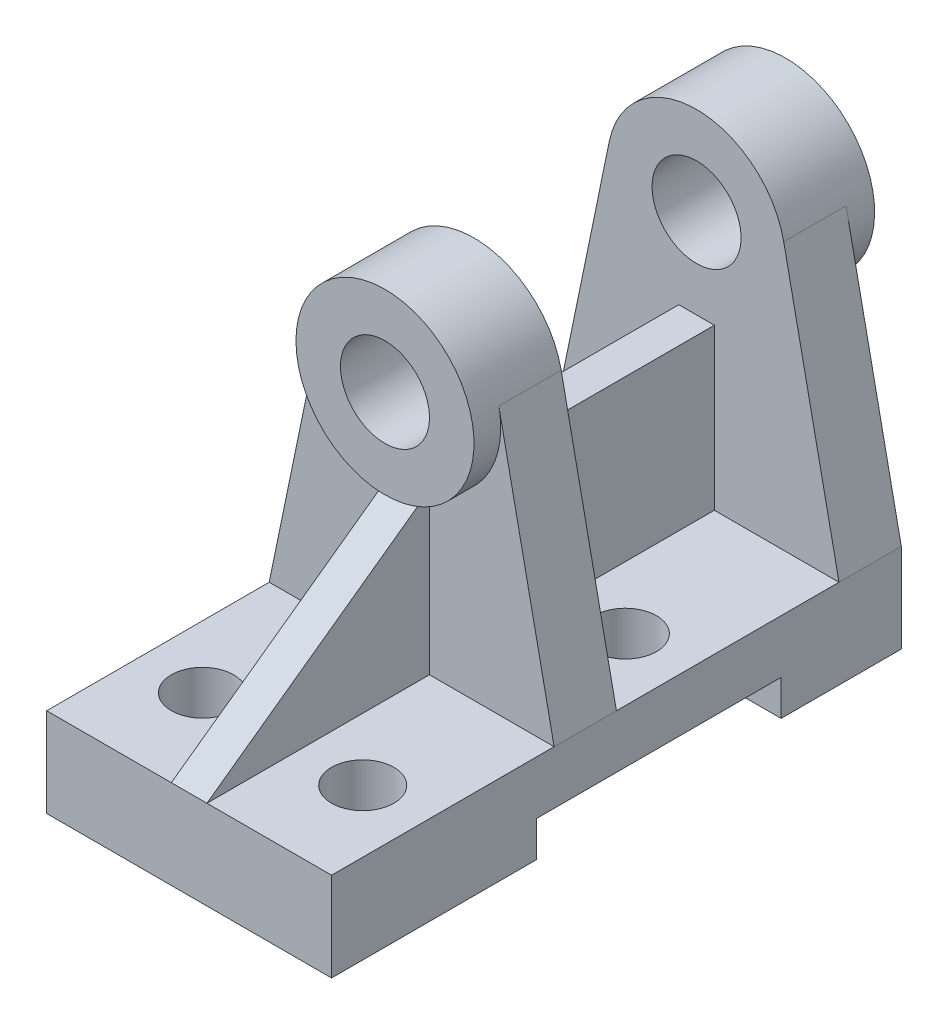
ISO-10303-21;
HEADER;
FILE_DESCRIPTION(('STEP AP214'),'2;1');
FILE_NAME('part.step','',(''),(''),'','','');
FILE_SCHEMA(('AUTOMOTIVE_DESIGN { 1 0 10303 214 1 1 1 1 }'));
ENDSEC;
DATA;
#1=APPLICATION_CONTEXT('core data for automotive mechanical design processes');
#2=APPLICATION_PROTOCOL_DEFINITION('international standard','automotive_design',2000,#1);
#3=PRODUCT_CONTEXT('',#1,'mechanical');
#4=PRODUCT('Part','Part','',(#3));
#5=PRODUCT_RELATED_PRODUCT_CATEGORY('part','',(#4));
#6=PRODUCT_DEFINITION_FORMATION('','',#4);
#7=PRODUCT_DEFINITION_CONTEXT('part definition',#1,'design');
#8=PRODUCT_DEFINITION('design','',#6,#7);
#9=PRODUCT_DEFINITION_SHAPE('','',#8);
#10=(LENGTH_UNIT() NAMED_UNIT(*) SI_UNIT(.MILLI.,.METRE.));
#11=(NAMED_UNIT(*) PLANE_ANGLE_UNIT() SI_UNIT($,.RADIAN.));
#12=(NAMED_UNIT(*) SI_UNIT($,.STERADIAN.) SOLID_ANGLE_UNIT());
#13=UNCERTAINTY_MEASURE_WITH_UNIT(LENGTH_MEASURE(1.E-05),#10,'distance_accuracy_value','');
#14=(GEOMETRIC_REPRESENTATION_CONTEXT(3) GLOBAL_UNCERTAINTY_ASSIGNED_CONTEXT((#13)) GLOBAL_UNIT_ASSIGNED_CONTEXT((#10,
#11,#12)) REPRESENTATION_CONTEXT('',''));
#15=CARTESIAN_POINT('',(0.,0.,0.));
#16=DIRECTION('',(0.,0.,1.));
#17=DIRECTION('',(1.,0.,0.));
#18=AXIS2_PLACEMENT_3D('',#15,#16,#17);
#19=CARTESIAN_POINT('',(0.,20.,0.));
#20=DIRECTION('',(0.,-1.,0.));
#21=DIRECTION('',(0.,0.,-1.));
#22=AXIS2_PLACEMENT_3D('',#19,#20,#21);
#23=PLANE('',#22);
#24=CARTESIAN_POINT('',(18.,20.,43.));
#25=DIRECTION('',(0.,1.,0.));
#26=DIRECTION('',(0.,0.,1.));
#27=AXIS2_PLACEMENT_3D('',#24,#25,#26);
#28=CIRCLE('',#27,7.);
#29=CARTESIAN_POINT('',(18.,20.,50.));
#30=VERTEX_POINT('',#29);
#31=EDGE_CURVE('E269',#30,#30,#28,.T.);
#32=ORIENTED_EDGE('',*,*,#31,.F.);
#33=EDGE_LOOP('',(#32));
#34=FACE_BOUND('',#33,.T.);
#35=DIRECTION('',(0.,0.,-1.));
#36=VECTOR('',#35,1.);
#37=CARTESIAN_POINT('',(4.,20.,64.));
#38=LINE('',#37,#36);
#39=CARTESIAN_POINT('',(4.,20.,64.));
#40=VERTEX_POINT('',#39);
#41=CARTESIAN_POINT('',(4.,20.,14.));
#42=VERTEX_POINT('',#41);
#43=EDGE_CURVE('E198',#40,#42,#38,.T.);
#44=ORIENTED_EDGE('',*,*,#43,.F.);
#45=DIRECTION('',(1.,0.,0.));
#46=VECTOR('',#45,1.);
#47=CARTESIAN_POINT('',(-32.,20.,64.));
#48=LINE('',#47,#46);
#49=CARTESIAN_POINT('',(32.,20.,64.));
#50=VERTEX_POINT('',#49);
#51=EDGE_CURVE('E221',#40,#50,#48,.T.);
#52=ORIENTED_EDGE('',*,*,#51,.T.);
#53=DIRECTION('',(0.,0.,-1.));
#54=VECTOR('',#53,1.);
#55=CARTESIAN_POINT('',(32.,20.,64.));
#56=LINE('',#55,#54);
#57=CARTESIAN_POINT('',(32.,20.,14.));
#58=VERTEX_POINT('',#57);
#59=EDGE_CURVE('E409',#50,#58,#56,.T.);
#60=ORIENTED_EDGE('',*,*,#59,.T.);
#61=DIRECTION('',(-1.,0.,0.));
#62=VECTOR('',#61,1.);
#63=CARTESIAN_POINT('',(32.,20.,14.));
#64=LINE('',#63,#62);
#65=EDGE_CURVE('E224',#58,#42,#64,.T.);
#66=ORIENTED_EDGE('',*,*,#65,.T.);
#67=EDGE_LOOP('',(#44,#52,#60,#66));
#68=FACE_BOUND('',#67,.T.);
#69=ADVANCED_FACE('F41',(#34,#68),#23,.F.);
#70=CARTESIAN_POINT('',(18.,20.,-16.));
#71=DIRECTION('',(0.,1.,0.));
#72=DIRECTION('',(0.,0.,1.));
#73=AXIS2_PLACEMENT_3D('',#70,#71,#72);
#74=CIRCLE('',#73,7.);
#75=CARTESIAN_POINT('',(18.,20.,-8.99999999999999));
#76=VERTEX_POINT('',#75);
#77=EDGE_CURVE('E259',#76,#76,#74,.T.);
#78=ORIENTED_EDGE('',*,*,#77,.F.);
#79=EDGE_LOOP('',(#78));
#80=FACE_BOUND('',#79,.T.);
#81=DIRECTION('',(0.,0.,-1.));
#82=VECTOR('',#81,1.);
#83=CARTESIAN_POINT('',(4.,20.,0.));
#84=LINE('',#83,#82);
#85=CARTESIAN_POINT('',(4.,20.,0.));
#86=VERTEX_POINT('',#85);
#87=CARTESIAN_POINT('',(4.,20.,-50.));
#88=VERTEX_POINT('',#87);
#89=EDGE_CURVE('E287',#86,#88,#84,.T.);
#90=ORIENTED_EDGE('',*,*,#89,.F.);
#91=DIRECTION('',(-1.,0.,0.));
#92=VECTOR('',#91,1.);
#93=CARTESIAN_POINT('',(32.,20.,0.));
#94=LINE('',#93,#92);
#95=CARTESIAN_POINT('',(32.,20.,0.));
#96=VERTEX_POINT('',#95);
#97=EDGE_CURVE('E344',#96,#86,#94,.T.);
#98=ORIENTED_EDGE('',*,*,#97,.F.);
#99=CARTESIAN_POINT('',(32.,20.,-50.));
#100=VERTEX_POINT('',#99);
#101=EDGE_CURVE('E251',#96,#100,#56,.T.);
#102=ORIENTED_EDGE('',*,*,#101,.T.);
#103=DIRECTION('',(1.,0.,0.));
#104=VECTOR('',#103,1.);
#105=CARTESIAN_POINT('',(0.,20.,-50.));
#106=LINE('',#105,#104);
#107=EDGE_CURVE('E389',#88,#100,#106,.T.);
#108=ORIENTED_EDGE('',*,*,#107,.F.);
#109=EDGE_LOOP('',(#90,#98,#102,#108));
#110=FACE_BOUND('',#109,.T.);
#111=ADVANCED_FACE('F415',(#80,#110),#23,.F.);
#112=CARTESIAN_POINT('',(0.,0.,-50.));
#113=DIRECTION('',(0.,0.,-1.));
#114=DIRECTION('',(-1.,0.,0.));
#115=AXIS2_PLACEMENT_3D('',#112,#113,#114);
#116=PLANE('',#115);
#117=CARTESIAN_POINT('',(0.,76.,-50.));
#118=DIRECTION('',(0.,0.,-1.));
#119=DIRECTION('',(-1.,0.,0.));
#120=AXIS2_PLACEMENT_3D('',#117,#118,#119);
#121=CIRCLE('',#120,10.);
#122=CARTESIAN_POINT('',(-10.,76.,-50.));
#123=VERTEX_POINT('',#122);
#124=EDGE_CURVE('E374',#123,#123,#121,.T.);
#125=ORIENTED_EDGE('',*,*,#124,.T.);
#126=EDGE_LOOP('',(#125));
#127=FACE_BOUND('',#126,.T.);
#128=DIRECTION('',(0.,1.,0.));
#129=VECTOR('',#128,1.);
#130=CARTESIAN_POINT('',(4.,20.,-50.));
#131=LINE('',#130,#129);
#132=CARTESIAN_POINT('',(4.,56.,-50.));
#133=VERTEX_POINT('',#132);
#134=EDGE_CURVE('E291',#88,#133,#131,.T.);
#135=ORIENTED_EDGE('',*,*,#134,.F.);
#136=ORIENTED_EDGE('',*,*,#107,.T.);
#137=DIRECTION('',(-0.202452606669412,0.979292061671471,0.));
#138=VECTOR('',#137,1.);
#139=CARTESIAN_POINT('',(34.6536187572094,7.16406853737846,-50.));
#140=LINE('',#139,#138);
#141=CARTESIAN_POINT('',(19.5858412334294,80.0490521333882,-50.));
#142=VERTEX_POINT('',#141);
#143=EDGE_CURVE('E386',#100,#142,#140,.T.);
#144=ORIENTED_EDGE('',*,*,#143,.T.);
#145=CARTESIAN_POINT('',(0.,76.,-50.));
#146=DIRECTION('',(0.,0.,-1.));
#147=DIRECTION('',(-1.,0.,0.));
#148=AXIS2_PLACEMENT_3D('',#145,#146,#147);
#149=CIRCLE('',#148,20.);
#150=CARTESIAN_POINT('',(-19.5858412334294,80.0490521333882,-50.));
#151=VERTEX_POINT('',#150);
#152=EDGE_CURVE('E377',#151,#142,#149,.T.);
#153=ORIENTED_EDGE('',*,*,#152,.F.);
#154=DIRECTION('',(0.202452606669412,0.979292061671471,0.));
#155=VECTOR('',#154,1.);
#156=CARTESIAN_POINT('',(-34.6536187572094,7.16406853737844,-50.));
#157=LINE('',#156,#155);
#158=CARTESIAN_POINT('',(-32.,20.,-50.));
#159=VERTEX_POINT('',#158);
#160=EDGE_CURVE('E393',#159,#151,#157,.T.);
#161=ORIENTED_EDGE('',*,*,#160,.F.);
#162=CARTESIAN_POINT('',(-4.,20.,-50.));
#163=VERTEX_POINT('',#162);
#164=EDGE_CURVE('E391',#159,#163,#106,.T.);
#165=ORIENTED_EDGE('',*,*,#164,.T.);
#166=DIRECTION('',(0.,1.,0.));
#167=VECTOR('',#166,1.);
#168=CARTESIAN_POINT('',(-4.,20.,-50.));
#169=LINE('',#168,#167);
#170=CARTESIAN_POINT('',(-4.,56.,-50.));
#171=VERTEX_POINT('',#170);
#172=EDGE_CURVE('E63',#163,#171,#169,.T.);
#173=ORIENTED_EDGE('',*,*,#172,.T.);
#174=DIRECTION('',(-1.,0.,0.));
#175=VECTOR('',#174,1.);
#176=CARTESIAN_POINT('',(4.,56.,-50.));
#177=LINE('',#176,#175);
#178=EDGE_CURVE('E58',#133,#171,#177,.T.);
#179=ORIENTED_EDGE('',*,*,#178,.F.);
#180=EDGE_LOOP('',(#135,#136,#144,#153,#161,#165,#173,#179));
#181=FACE_BOUND('',#180,.T.);
#182=ADVANCED_FACE('F423',(#127,#181),#116,.F.);
#183=CARTESIAN_POINT('',(0.,76.,0.));
#184=DIRECTION('',(0.,0.,-1.));
#185=DIRECTION('',(-1.,0.,0.));
#186=AXIS2_PLACEMENT_3D('',#183,#184,#185);
#187=PLANE('',#186);
#188=CARTESIAN_POINT('',(0.,76.,0.));
#189=DIRECTION('',(0.,0.,-1.));
#190=DIRECTION('',(-1.,0.,0.));
#191=AXIS2_PLACEMENT_3D('',#188,#189,#190);
#192=CIRCLE('',#191,10.);
#193=CARTESIAN_POINT('',(-10.,76.,0.));
#194=VERTEX_POINT('',#193);
#195=EDGE_CURVE('E325',#194,#194,#192,.T.);
#196=ORIENTED_EDGE('',*,*,#195,.F.);
#197=EDGE_LOOP('',(#196));
#198=FACE_BOUND('',#197,.T.);
#199=ORIENTED_EDGE('',*,*,#97,.T.);
#200=DIRECTION('',(0.,-1.,0.));
#201=VECTOR('',#200,1.);
#202=CARTESIAN_POINT('',(4.,56.,0.));
#203=LINE('',#202,#201);
#204=CARTESIAN_POINT('',(4.,56.,0.));
#205=VERTEX_POINT('',#204);
#206=EDGE_CURVE('E299',#205,#86,#203,.T.);
#207=ORIENTED_EDGE('',*,*,#206,.F.);
#208=DIRECTION('',(-1.,0.,0.));
#209=VECTOR('',#208,1.);
#210=CARTESIAN_POINT('',(4.,56.,0.));
#211=LINE('',#210,#209);
#212=CARTESIAN_POINT('',(-4.,56.,0.));
#213=VERTEX_POINT('',#212);
#214=EDGE_CURVE('E285',#205,#213,#211,.T.);
#215=ORIENTED_EDGE('',*,*,#214,.T.);
#216=DIRECTION('',(0.,-1.,0.));
#217=VECTOR('',#216,1.);
#218=CARTESIAN_POINT('',(-4.,56.,0.));
#219=LINE('',#218,#217);
#220=CARTESIAN_POINT('',(-4.,20.,0.));
#221=VERTEX_POINT('',#220);
#222=EDGE_CURVE('E290',#213,#221,#219,.T.);
#223=ORIENTED_EDGE('',*,*,#222,.T.);
#224=CARTESIAN_POINT('',(-32.,20.,0.));
#225=VERTEX_POINT('',#224);
#226=EDGE_CURVE('E348',#221,#225,#94,.T.);
#227=ORIENTED_EDGE('',*,*,#226,.T.);
#228=DIRECTION('',(0.202452606669412,0.979292061671471,0.));
#229=VECTOR('',#228,1.);
#230=CARTESIAN_POINT('',(-32.,20.,0.));
#231=LINE('',#230,#229);
#232=CARTESIAN_POINT('',(-19.5858412334294,80.0490521333883,0.));
#233=VERTEX_POINT('',#232);
#234=EDGE_CURVE('E347',#225,#233,#231,.T.);
#235=ORIENTED_EDGE('',*,*,#234,.T.);
#236=CARTESIAN_POINT('',(0.,76.,0.));
#237=DIRECTION('',(0.,0.,-1.));
#238=DIRECTION('',(-1.,0.,0.));
#239=AXIS2_PLACEMENT_3D('',#236,#237,#238);
#240=CIRCLE('',#239,20.);
#241=CARTESIAN_POINT('',(19.5858412334294,80.0490521333883,0.));
#242=VERTEX_POINT('',#241);
#243=EDGE_CURVE('E335',#233,#242,#240,.T.);
#244=ORIENTED_EDGE('',*,*,#243,.T.);
#245=DIRECTION('',(0.202452606669412,-0.979292061671471,0.));
#246=VECTOR('',#245,1.);
#247=CARTESIAN_POINT('',(32.,20.,0.));
#248=LINE('',#247,#246);
#249=EDGE_CURVE('E350',#242,#96,#248,.T.);
#250=ORIENTED_EDGE('',*,*,#249,.T.);
#251=EDGE_LOOP('',(#199,#207,#215,#223,#227,#235,#244,#250));
#252=FACE_BOUND('',#251,.T.);
#253=ADVANCED_FACE('F430',(#198,#252),#187,.T.);
#254=CARTESIAN_POINT('',(0.,76.,14.));
#255=DIRECTION('',(0.,0.,-1.));
#256=DIRECTION('',(-1.,0.,0.));
#257=AXIS2_PLACEMENT_3D('',#254,#255,#256);
#258=PLANE('',#257);
#259=DIRECTION('',(0.,1.,0.));
#260=VECTOR('',#259,1.);
#261=CARTESIAN_POINT('',(4.,56.,14.));
#262=LINE('',#261,#260);
#263=CARTESIAN_POINT('',(4.,56.,14.));
#264=VERTEX_POINT('',#263);
#265=EDGE_CURVE('E200',#42,#264,#262,.T.);
#266=ORIENTED_EDGE('',*,*,#265,.F.);
#267=ORIENTED_EDGE('',*,*,#65,.F.);
#268=DIRECTION('',(0.202452606669412,-0.979292061671471,0.));
#269=VECTOR('',#268,1.);
#270=CARTESIAN_POINT('',(32.,20.,14.));
#271=LINE('',#270,#269);
#272=CARTESIAN_POINT('',(19.5858412334294,80.0490521333883,14.));
#273=VERTEX_POINT('',#272);
#274=EDGE_CURVE('E361',#273,#58,#271,.T.);
#275=ORIENTED_EDGE('',*,*,#274,.F.);
#276=CARTESIAN_POINT('',(0.,76.,14.));
#277=DIRECTION('',(0.,0.,1.));
#278=DIRECTION('',(-1.,0.,0.));
#279=AXIS2_PLACEMENT_3D('',#276,#277,#278);
#280=CIRCLE('',#279,20.);
#281=CARTESIAN_POINT('',(0.,56.,14.));
#282=VERTEX_POINT('',#281);
#283=EDGE_CURVE('E357',#282,#273,#280,.T.);
#284=ORIENTED_EDGE('',*,*,#283,.F.);
#285=DIRECTION('',(-1.,0.,0.));
#286=VECTOR('',#285,1.);
#287=CARTESIAN_POINT('',(4.,56.,14.));
#288=LINE('',#287,#286);
#289=EDGE_CURVE('E216',#264,#282,#288,.T.);
#290=ORIENTED_EDGE('',*,*,#289,.F.);
#291=EDGE_LOOP('',(#266,#267,#275,#284,#290));
#292=FACE_BOUND('',#291,.T.);
#293=ADVANCED_FACE('F494',(#292),#258,.F.);
#294=CARTESIAN_POINT('',(-4.,56.,14.));
#295=VERTEX_POINT('',#294);
#296=EDGE_CURVE('E276',#282,#295,#288,.T.);
#297=ORIENTED_EDGE('',*,*,#296,.F.);
#298=CARTESIAN_POINT('',(-19.5858412334294,80.0490521333883,14.));
#299=VERTEX_POINT('',#298);
#300=EDGE_CURVE('E358',#299,#282,#280,.T.);
#301=ORIENTED_EDGE('',*,*,#300,.F.);
#302=DIRECTION('',(0.202452606669412,0.979292061671471,0.));
#303=VECTOR('',#302,1.);
#304=CARTESIAN_POINT('',(-32.,20.,14.));
#305=LINE('',#304,#303);
#306=CARTESIAN_POINT('',(-32.,20.,14.));
#307=VERTEX_POINT('',#306);
#308=EDGE_CURVE('E355',#307,#299,#305,.T.);
#309=ORIENTED_EDGE('',*,*,#308,.F.);
#310=CARTESIAN_POINT('',(-4.,20.,14.));
#311=VERTEX_POINT('',#310);
#312=EDGE_CURVE('E341',#311,#307,#64,.T.);
#313=ORIENTED_EDGE('',*,*,#312,.F.);
#314=DIRECTION('',(0.,1.,0.));
#315=VECTOR('',#314,1.);
#316=CARTESIAN_POINT('',(-4.,56.,14.));
#317=LINE('',#316,#315);
#318=EDGE_CURVE('E203',#311,#295,#317,.T.);
#319=ORIENTED_EDGE('',*,*,#318,.T.);
#320=EDGE_LOOP('',(#297,#301,#309,#313,#319));
#321=FACE_BOUND('',#320,.T.);
#322=ADVANCED_FACE('F497',(#321),#258,.F.);
#323=CARTESIAN_POINT('',(0.,0.,0.));
#324=DIRECTION('',(0.,-1.,0.));
#325=DIRECTION('',(0.,0.,-1.));
#326=AXIS2_PLACEMENT_3D('',#323,#324,#325);
#327=PLANE('',#326);
#328=DIRECTION('',(1.,0.,0.));
#329=VECTOR('',#328,1.);
#330=CARTESIAN_POINT('',(-32.,0.,-37.));
#331=LINE('',#330,#329);
#332=CARTESIAN_POINT('',(-32.,0.,-37.));
#333=VERTEX_POINT('',#332);
#334=CARTESIAN_POINT('',(32.,0.,-37.));
#335=VERTEX_POINT('',#334);
#336=EDGE_CURVE('E311',#333,#335,#331,.T.);
#337=ORIENTED_EDGE('',*,*,#336,.F.);
#338=DIRECTION('',(0.,0.,1.));
#339=VECTOR('',#338,1.);
#340=CARTESIAN_POINT('',(-32.,0.,64.));
#341=LINE('',#340,#339);
#342=CARTESIAN_POINT('',(-32.,0.,-64.));
#343=VERTEX_POINT('',#342);
#344=EDGE_CURVE('E246',#343,#333,#341,.T.);
#345=ORIENTED_EDGE('',*,*,#344,.F.);
#346=DIRECTION('',(-1.,0.,0.));
#347=VECTOR('',#346,1.);
#348=CARTESIAN_POINT('',(-32.,0.,-64.));
#349=LINE('',#348,#347);
#350=CARTESIAN_POINT('',(32.,0.,-64.));
#351=VERTEX_POINT('',#350);
#352=EDGE_CURVE('E242',#351,#343,#349,.T.);
#353=ORIENTED_EDGE('',*,*,#352,.F.);
#354=DIRECTION('',(0.,0.,-1.));
#355=VECTOR('',#354,1.);
#356=CARTESIAN_POINT('',(32.,0.,64.));
#357=LINE('',#356,#355);
#358=EDGE_CURVE('E243',#335,#351,#357,.T.);
#359=ORIENTED_EDGE('',*,*,#358,.F.);
#360=EDGE_LOOP('',(#337,#345,#353,#359));
#361=FACE_BOUND('',#360,.T.);
#362=ADVANCED_FACE('F460',(#361),#327,.T.);
#363=CARTESIAN_POINT('',(-18.,20.,43.));
#364=DIRECTION('',(0.,1.,0.));
#365=DIRECTION('',(0.,0.,1.));
#366=AXIS2_PLACEMENT_3D('',#363,#364,#365);
#367=CIRCLE('',#366,7.);
#368=CARTESIAN_POINT('',(-18.,20.,50.));
#369=VERTEX_POINT('',#368);
#370=EDGE_CURVE('E526',#369,#369,#367,.T.);
#371=ORIENTED_EDGE('',*,*,#370,.F.);
#372=EDGE_LOOP('',(#371));
#373=FACE_BOUND('',#372,.T.);
#374=CARTESIAN_POINT('',(-32.,20.,64.));
#375=VERTEX_POINT('',#374);
#376=CARTESIAN_POINT('',(-4.,20.,64.));
#377=VERTEX_POINT('',#376);
#378=EDGE_CURVE('E230',#375,#377,#48,.T.);
#379=ORIENTED_EDGE('',*,*,#378,.T.);
#380=DIRECTION('',(0.,0.,-1.));
#381=VECTOR('',#380,1.);
#382=CARTESIAN_POINT('',(-4.,20.,64.));
#383=LINE('',#382,#381);
#384=EDGE_CURVE('E278',#377,#311,#383,.T.);
#385=ORIENTED_EDGE('',*,*,#384,.T.);
#386=ORIENTED_EDGE('',*,*,#312,.T.);
#387=DIRECTION('',(0.,0.,1.));
#388=VECTOR('',#387,1.);
#389=CARTESIAN_POINT('',(-32.,20.,64.));
#390=LINE('',#389,#388);
#391=EDGE_CURVE('E236',#307,#375,#390,.T.);
#392=ORIENTED_EDGE('',*,*,#391,.T.);
#393=EDGE_LOOP('',(#379,#385,#386,#392));
#394=FACE_BOUND('',#393,.T.);
#395=ADVANCED_FACE('F502',(#373,#394),#23,.F.);
#396=CARTESIAN_POINT('',(-18.,20.,-16.));
#397=DIRECTION('',(0.,1.,0.));
#398=DIRECTION('',(0.,0.,-1.));
#399=AXIS2_PLACEMENT_3D('',#396,#397,#398);
#400=CIRCLE('',#399,7.);
#401=CARTESIAN_POINT('',(-18.,20.,-23.));
#402=VERTEX_POINT('',#401);
#403=EDGE_CURVE('E264',#402,#402,#400,.T.);
#404=ORIENTED_EDGE('',*,*,#403,.F.);
#405=EDGE_LOOP('',(#404));
#406=FACE_BOUND('',#405,.T.);
#407=ORIENTED_EDGE('',*,*,#226,.F.);
#408=DIRECTION('',(0.,0.,-1.));
#409=VECTOR('',#408,1.);
#410=CARTESIAN_POINT('',(-4.,20.,0.));
#411=LINE('',#410,#409);
#412=EDGE_CURVE('E288',#221,#163,#411,.T.);
#413=ORIENTED_EDGE('',*,*,#412,.T.);
#414=ORIENTED_EDGE('',*,*,#164,.F.);
#415=EDGE_CURVE('E234',#159,#225,#390,.T.);
#416=ORIENTED_EDGE('',*,*,#415,.T.);
#417=EDGE_LOOP('',(#407,#413,#414,#416));
#418=FACE_BOUND('',#417,.T.);
#419=ADVANCED_FACE('F483',(#406,#418),#23,.F.);
#420=CARTESIAN_POINT('',(32.,20.,64.));
#421=DIRECTION('',(-1.,0.,0.));
#422=DIRECTION('',(0.,0.,1.));
#423=AXIS2_PLACEMENT_3D('',#420,#421,#422);
#424=PLANE('',#423);
#425=DIRECTION('',(0.,0.,1.));
#426=VECTOR('',#425,1.);
#427=CARTESIAN_POINT('',(32.,8.,-37.));
#428=LINE('',#427,#426);
#429=CARTESIAN_POINT('',(32.,8.,-37.));
#430=VERTEX_POINT('',#429);
#431=CARTESIAN_POINT('',(32.,8.,18.));
#432=VERTEX_POINT('',#431);
#433=EDGE_CURVE('E307',#430,#432,#428,.T.);
#434=ORIENTED_EDGE('',*,*,#433,.F.);
#435=DIRECTION('',(0.,-1.,0.));
#436=VECTOR('',#435,1.);
#437=CARTESIAN_POINT('',(32.,8.,-37.));
#438=LINE('',#437,#436);
#439=EDGE_CURVE('E322',#430,#335,#438,.T.);
#440=ORIENTED_EDGE('',*,*,#439,.T.);
#441=ORIENTED_EDGE('',*,*,#358,.T.);
#442=DIRECTION('',(0.,-1.,0.));
#443=VECTOR('',#442,1.);
#444=CARTESIAN_POINT('',(32.,20.,-64.));
#445=LINE('',#444,#443);
#446=CARTESIAN_POINT('',(32.,20.,-64.));
#447=VERTEX_POINT('',#446);
#448=EDGE_CURVE('E11',#447,#351,#445,.T.);
#449=ORIENTED_EDGE('',*,*,#448,.F.);
#450=DIRECTION('',(0.,0.,-1.));
#451=VECTOR('',#450,1.);
#452=CARTESIAN_POINT('',(32.,20.,-50.));
#453=LINE('',#452,#451);
#454=EDGE_CURVE('E406',#100,#447,#453,.T.);
#455=ORIENTED_EDGE('',*,*,#454,.F.);
#456=ORIENTED_EDGE('',*,*,#101,.F.);
#457=DIRECTION('',(0.,0.,1.));
#458=VECTOR('',#457,1.);
#459=CARTESIAN_POINT('',(32.,20.,0.));
#460=LINE('',#459,#458);
#461=EDGE_CURVE('E353',#96,#58,#460,.T.);
#462=ORIENTED_EDGE('',*,*,#461,.T.);
#463=ORIENTED_EDGE('',*,*,#59,.F.);
#464=DIRECTION('',(0.,-1.,0.));
#465=VECTOR('',#464,1.);
#466=CARTESIAN_POINT('',(32.,20.,64.));
#467=LINE('',#466,#465);
#468=CARTESIAN_POINT('',(32.,0.,64.));
#469=VERTEX_POINT('',#468);
#470=EDGE_CURVE('E228',#50,#469,#467,.T.);
#471=ORIENTED_EDGE('',*,*,#470,.T.);
#472=CARTESIAN_POINT('',(32.,0.,18.));
#473=VERTEX_POINT('',#472);
#474=EDGE_CURVE('E239',#469,#473,#357,.T.);
#475=ORIENTED_EDGE('',*,*,#474,.T.);
#476=DIRECTION('',(0.,-1.,0.));
#477=VECTOR('',#476,1.);
#478=CARTESIAN_POINT('',(32.,8.,18.));
#479=LINE('',#478,#477);
#480=EDGE_CURVE('E319',#432,#473,#479,.T.);
#481=ORIENTED_EDGE('',*,*,#480,.F.);
#482=EDGE_LOOP('',(#434,#440,#441,#449,#455,#456,#462,#463,#471,#475,#481));
#483=FACE_BOUND('',#482,.T.);
#484=ADVANCED_FACE('F43',(#483),#424,.F.);
#485=CARTESIAN_POINT('',(-32.,20.,-64.));
#486=DIRECTION('',(0.,0.,1.));
#487=DIRECTION('',(1.,0.,0.));
#488=AXIS2_PLACEMENT_3D('',#485,#486,#487);
#489=PLANE('',#488);
#490=ORIENTED_EDGE('',*,*,#352,.T.);
#491=DIRECTION('',(0.,-1.,0.));
#492=VECTOR('',#491,1.);
#493=CARTESIAN_POINT('',(-32.,20.,-64.));
#494=LINE('',#493,#492);
#495=CARTESIAN_POINT('',(-32.,20.,-64.));
#496=VERTEX_POINT('',#495);
#497=EDGE_CURVE('E50',#496,#343,#494,.T.);
#498=ORIENTED_EDGE('',*,*,#497,.F.);
#499=DIRECTION('',(0.202452606669412,0.979292061671471,0.));
#500=VECTOR('',#499,1.);
#501=CARTESIAN_POINT('',(-34.6536187572094,7.16406853737844,-64.));
#502=LINE('',#501,#500);
#503=CARTESIAN_POINT('',(-19.5858412334294,80.0490521333883,-64.));
#504=VERTEX_POINT('',#503);
#505=EDGE_CURVE('E390',#496,#504,#502,.T.);
#506=ORIENTED_EDGE('',*,*,#505,.T.);
#507=CARTESIAN_POINT('',(0.,76.,-64.));
#508=DIRECTION('',(0.,0.,-1.));
#509=DIRECTION('',(-1.,0.,0.));
#510=AXIS2_PLACEMENT_3D('',#507,#508,#509);
#511=CIRCLE('',#510,20.);
#512=CARTESIAN_POINT('',(19.5858412334294,80.0490521333883,-64.));
#513=VERTEX_POINT('',#512);
#514=EDGE_CURVE('E385',#513,#504,#511,.T.);
#515=ORIENTED_EDGE('',*,*,#514,.F.);
#516=DIRECTION('',(-0.202452606669412,0.979292061671471,0.));
#517=VECTOR('',#516,1.);
#518=CARTESIAN_POINT('',(34.6536187572094,7.16406853737846,-64.));
#519=LINE('',#518,#517);
#520=EDGE_CURVE('E398',#447,#513,#519,.T.);
#521=ORIENTED_EDGE('',*,*,#520,.F.);
#522=ORIENTED_EDGE('',*,*,#448,.T.);
#523=EDGE_LOOP('',(#490,#498,#506,#515,#521,#522));
#524=FACE_BOUND('',#523,.T.);
#525=ADVANCED_FACE('F463',(#524),#489,.F.);
#526=CARTESIAN_POINT('',(-32.,20.,64.));
#527=DIRECTION('',(1.,0.,0.));
#528=DIRECTION('',(0.,0.,-1.));
#529=AXIS2_PLACEMENT_3D('',#526,#527,#528);
#530=PLANE('',#529);
#531=ORIENTED_EDGE('',*,*,#344,.T.);
#532=DIRECTION('',(0.,-1.,0.));
#533=VECTOR('',#532,1.);
#534=CARTESIAN_POINT('',(-32.,8.,-37.));
#535=LINE('',#534,#533);
#536=CARTESIAN_POINT('',(-32.,8.,-37.));
#537=VERTEX_POINT('',#536);
#538=EDGE_CURVE('E326',#537,#333,#535,.T.);
#539=ORIENTED_EDGE('',*,*,#538,.F.);
#540=DIRECTION('',(0.,0.,-1.));
#541=VECTOR('',#540,1.);
#542=CARTESIAN_POINT('',(-32.,8.,-37.));
#543=LINE('',#542,#541);
#544=CARTESIAN_POINT('',(-32.,8.,18.));
#545=VERTEX_POINT('',#544);
#546=EDGE_CURVE('E314',#545,#537,#543,.T.);
#547=ORIENTED_EDGE('',*,*,#546,.F.);
#548=DIRECTION('',(0.,-1.,0.));
#549=VECTOR('',#548,1.);
#550=CARTESIAN_POINT('',(-32.,8.,18.));
#551=LINE('',#550,#549);
#552=CARTESIAN_POINT('',(-32.,0.,18.));
#553=VERTEX_POINT('',#552);
#554=EDGE_CURVE('E328',#545,#553,#551,.T.);
#555=ORIENTED_EDGE('',*,*,#554,.T.);
#556=CARTESIAN_POINT('',(-32.,0.,64.));
#557=VERTEX_POINT('',#556);
#558=EDGE_CURVE('E245',#553,#557,#341,.T.);
#559=ORIENTED_EDGE('',*,*,#558,.T.);
#560=DIRECTION('',(0.,-1.,0.));
#561=VECTOR('',#560,1.);
#562=CARTESIAN_POINT('',(-32.,20.,64.));
#563=LINE('',#562,#561);
#564=EDGE_CURVE('E253',#375,#557,#563,.T.);
#565=ORIENTED_EDGE('',*,*,#564,.F.);
#566=ORIENTED_EDGE('',*,*,#391,.F.);
#567=DIRECTION('',(0.,0.,1.));
#568=VECTOR('',#567,1.);
#569=CARTESIAN_POINT('',(-32.,20.,0.));
#570=LINE('',#569,#568);
#571=EDGE_CURVE('E371',#225,#307,#570,.T.);
#572=ORIENTED_EDGE('',*,*,#571,.F.);
#573=ORIENTED_EDGE('',*,*,#415,.F.);
#574=EDGE_CURVE('E231',#496,#159,#390,.T.);
#575=ORIENTED_EDGE('',*,*,#574,.F.);
#576=ORIENTED_EDGE('',*,*,#497,.T.);
#577=EDGE_LOOP('',(#531,#539,#547,#555,#559,#565,#566,#572,#573,#575,#576));
#578=FACE_BOUND('',#577,.T.);
#579=ADVANCED_FACE('F448',(#578),#530,.F.);
#580=CARTESIAN_POINT('',(-32.,20.,64.));
#581=DIRECTION('',(0.,0.,-1.));
#582=DIRECTION('',(-1.,0.,0.));
#583=AXIS2_PLACEMENT_3D('',#580,#581,#582);
#584=PLANE('',#583);
#585=DIRECTION('',(1.,0.,0.));
#586=VECTOR('',#585,1.);
#587=CARTESIAN_POINT('',(-32.,0.,64.));
#588=LINE('',#587,#586);
#589=EDGE_CURVE('E249',#557,#469,#588,.T.);
#590=ORIENTED_EDGE('',*,*,#589,.T.);
#591=ORIENTED_EDGE('',*,*,#470,.F.);
#592=ORIENTED_EDGE('',*,*,#51,.F.);
#593=DIRECTION('',(-1.,0.,0.));
#594=VECTOR('',#593,1.);
#595=CARTESIAN_POINT('',(4.,20.,64.));
#596=LINE('',#595,#594);
#597=EDGE_CURVE('E207',#40,#377,#596,.T.);
#598=ORIENTED_EDGE('',*,*,#597,.T.);
#599=ORIENTED_EDGE('',*,*,#378,.F.);
#600=ORIENTED_EDGE('',*,*,#564,.T.);
#601=EDGE_LOOP('',(#590,#591,#592,#598,#599,#600));
#602=FACE_BOUND('',#601,.T.);
#603=ADVANCED_FACE('F226',(#602),#584,.F.);
#604=CARTESIAN_POINT('',(18.,0.,43.));
#605=DIRECTION('',(0.,1.,0.));
#606=DIRECTION('',(0.,0.,1.));
#607=AXIS2_PLACEMENT_3D('',#604,#605,#606);
#608=CIRCLE('',#607,7.);
#609=CARTESIAN_POINT('',(18.,0.,50.));
#610=VERTEX_POINT('',#609);
#611=EDGE_CURVE('E272',#610,#610,#608,.T.);
#612=ORIENTED_EDGE('',*,*,#611,.T.);
#613=EDGE_LOOP('',(#612));
#614=FACE_BOUND('',#613,.T.);
#615=CARTESIAN_POINT('',(-18.,0.,43.));
#616=DIRECTION('',(0.,1.,0.));
#617=DIRECTION('',(0.,0.,1.));
#618=AXIS2_PLACEMENT_3D('',#615,#616,#617);
#619=CIRCLE('',#618,7.);
#620=CARTESIAN_POINT('',(-18.,0.,50.));
#621=VERTEX_POINT('',#620);
#622=EDGE_CURVE('E528',#621,#621,#619,.T.);
#623=ORIENTED_EDGE('',*,*,#622,.T.);
#624=EDGE_LOOP('',(#623));
#625=FACE_BOUND('',#624,.T.);
#626=DIRECTION('',(-1.,0.,0.));
#627=VECTOR('',#626,1.);
#628=CARTESIAN_POINT('',(-32.,0.,18.));
#629=LINE('',#628,#627);
#630=EDGE_CURVE('E215',#473,#553,#629,.T.);
#631=ORIENTED_EDGE('',*,*,#630,.F.);
#632=ORIENTED_EDGE('',*,*,#474,.F.);
#633=ORIENTED_EDGE('',*,*,#589,.F.);
#634=ORIENTED_EDGE('',*,*,#558,.F.);
#635=EDGE_LOOP('',(#631,#632,#633,#634));
#636=FACE_BOUND('',#635,.T.);
#637=ADVANCED_FACE('F442',(#614,#625,#636),#327,.T.);
#638=CARTESIAN_POINT('',(-34.6536187572094,7.16406853737844,-50.));
#639=DIRECTION('',(-0.979292061671471,0.202452606669412,0.));
#640=DIRECTION('',(-0.202452606669412,-0.979292061671471,0.));
#641=AXIS2_PLACEMENT_3D('',#638,#639,#640);
#642=PLANE('',#641);
#643=ORIENTED_EDGE('',*,*,#505,.F.);
#644=ORIENTED_EDGE('',*,*,#574,.T.);
#645=ORIENTED_EDGE('',*,*,#160,.T.);
#646=DIRECTION('',(0.,0.,-1.));
#647=VECTOR('',#646,1.);
#648=CARTESIAN_POINT('',(-19.5858412334294,80.0490521333882,-50.));
#649=LINE('',#648,#647);
#650=EDGE_CURVE('E403',#151,#504,#649,.T.);
#651=ORIENTED_EDGE('',*,*,#650,.T.);
#652=EDGE_LOOP('',(#643,#644,#645,#651));
#653=FACE_BOUND('',#652,.T.);
#654=ADVANCED_FACE('F470',(#653),#642,.T.);
#655=CARTESIAN_POINT('',(34.6536187572094,7.16406853737846,-50.));
#656=DIRECTION('',(-0.979292061671471,-0.202452606669412,0.));
#657=DIRECTION('',(0.202452606669412,-0.979292061671471,0.));
#658=AXIS2_PLACEMENT_3D('',#655,#656,#657);
#659=PLANE('',#658);
#660=ORIENTED_EDGE('',*,*,#520,.T.);
#661=DIRECTION('',(0.,0.,-1.));
#662=VECTOR('',#661,1.);
#663=CARTESIAN_POINT('',(19.5858412334294,80.0490521333882,-50.));
#664=LINE('',#663,#662);
#665=EDGE_CURVE('E396',#142,#513,#664,.T.);
#666=ORIENTED_EDGE('',*,*,#665,.F.);
#667=ORIENTED_EDGE('',*,*,#143,.F.);
#668=ORIENTED_EDGE('',*,*,#454,.T.);
#669=EDGE_LOOP('',(#660,#666,#667,#668));
#670=FACE_BOUND('',#669,.T.);
#671=ADVANCED_FACE('F422',(#670),#659,.F.);
#672=CARTESIAN_POINT('',(0.,76.,-70.));
#673=DIRECTION('',(0.,0.,1.));
#674=DIRECTION('',(1.,0.,0.));
#675=AXIS2_PLACEMENT_3D('',#672,#673,#674);
#676=CYLINDRICAL_SURFACE('',#675,10.);
#677=CARTESIAN_POINT('',(0.,76.,-70.));
#678=DIRECTION('',(0.,0.,-1.));
#679=DIRECTION('',(-1.,0.,0.));
#680=AXIS2_PLACEMENT_3D('',#677,#678,#679);
#681=CIRCLE('',#680,10.);
#682=CARTESIAN_POINT('',(-10.,76.,-70.));
#683=VERTEX_POINT('',#682);
#684=EDGE_CURVE('E379',#683,#683,#681,.T.);
#685=ORIENTED_EDGE('',*,*,#684,.T.);
#686=EDGE_LOOP('',(#685));
#687=FACE_BOUND('',#686,.T.);
#688=ORIENTED_EDGE('',*,*,#124,.F.);
#689=EDGE_LOOP('',(#688));
#690=FACE_BOUND('',#689,.T.);
#691=ADVANCED_FACE('F596',(#687,#690),#676,.F.);
#692=CARTESIAN_POINT('',(0.,76.,-70.));
#693=DIRECTION('',(0.,0.,1.));
#694=DIRECTION('',(1.,0.,0.));
#695=AXIS2_PLACEMENT_3D('',#692,#693,#694);
#696=CYLINDRICAL_SURFACE('',#695,20.);
#697=ORIENTED_EDGE('',*,*,#650,.F.);
#698=ORIENTED_EDGE('',*,*,#152,.T.);
#699=ORIENTED_EDGE('',*,*,#665,.T.);
#700=ORIENTED_EDGE('',*,*,#514,.T.);
#701=EDGE_LOOP('',(#697,#698,#699,#700));
#702=FACE_BOUND('',#701,.T.);
#703=CARTESIAN_POINT('',(0.,76.,-70.));
#704=DIRECTION('',(0.,0.,-1.));
#705=DIRECTION('',(-1.,0.,0.));
#706=AXIS2_PLACEMENT_3D('',#703,#704,#705);
#707=CIRCLE('',#706,20.);
#708=CARTESIAN_POINT('',(-20.,76.,-70.));
#709=VERTEX_POINT('',#708);
#710=EDGE_CURVE('E382',#709,#709,#707,.T.);
#711=ORIENTED_EDGE('',*,*,#710,.F.);
#712=EDGE_LOOP('',(#711));
#713=FACE_BOUND('',#712,.T.);
#714=ADVANCED_FACE('F467',(#702,#713),#696,.T.);
#715=CARTESIAN_POINT('',(0.,0.,-70.));
#716=DIRECTION('',(0.,0.,-1.));
#717=DIRECTION('',(-1.,0.,0.));
#718=AXIS2_PLACEMENT_3D('',#715,#716,#717);
#719=PLANE('',#718);
#720=ORIENTED_EDGE('',*,*,#684,.F.);
#721=EDGE_LOOP('',(#720));
#722=FACE_BOUND('',#721,.T.);
#723=ORIENTED_EDGE('',*,*,#710,.T.);
#724=EDGE_LOOP('',(#723));
#725=FACE_BOUND('',#724,.T.);
#726=ADVANCED_FACE('F590',(#722,#725),#719,.T.);
#727=CARTESIAN_POINT('',(-32.,20.,0.));
#728=DIRECTION('',(0.979292061671471,-0.202452606669412,0.));
#729=DIRECTION('',(0.202452606669412,0.979292061671471,0.));
#730=AXIS2_PLACEMENT_3D('',#727,#728,#729);
#731=PLANE('',#730);
#732=ORIENTED_EDGE('',*,*,#308,.T.);
#733=DIRECTION('',(0.,0.,1.));
#734=VECTOR('',#733,1.);
#735=CARTESIAN_POINT('',(-19.5858412334294,80.0490521333883,0.));
#736=LINE('',#735,#734);
#737=EDGE_CURVE('E368',#233,#299,#736,.T.);
#738=ORIENTED_EDGE('',*,*,#737,.F.);
#739=ORIENTED_EDGE('',*,*,#234,.F.);
#740=ORIENTED_EDGE('',*,*,#571,.T.);
#741=EDGE_LOOP('',(#732,#738,#739,#740));
#742=FACE_BOUND('',#741,.T.);
#743=ADVANCED_FACE('F487',(#742),#731,.F.);
#744=CARTESIAN_POINT('',(32.,20.,0.));
#745=DIRECTION('',(-0.979292061671471,-0.202452606669412,0.));
#746=DIRECTION('',(0.202452606669412,-0.979292061671471,0.));
#747=AXIS2_PLACEMENT_3D('',#744,#745,#746);
#748=PLANE('',#747);
#749=ORIENTED_EDGE('',*,*,#274,.T.);
#750=ORIENTED_EDGE('',*,*,#461,.F.);
#751=ORIENTED_EDGE('',*,*,#249,.F.);
#752=DIRECTION('',(0.,0.,1.));
#753=VECTOR('',#752,1.);
#754=CARTESIAN_POINT('',(19.5858412334294,80.0490521333883,0.));
#755=LINE('',#754,#753);
#756=EDGE_CURVE('E365',#242,#273,#755,.T.);
#757=ORIENTED_EDGE('',*,*,#756,.T.);
#758=EDGE_LOOP('',(#749,#750,#751,#757));
#759=FACE_BOUND('',#758,.T.);
#760=ADVANCED_FACE('F435',(#759),#748,.F.);
#761=CARTESIAN_POINT('',(0.,76.,20.));
#762=DIRECTION('',(0.,0.,-1.));
#763=DIRECTION('',(-1.,0.,0.));
#764=AXIS2_PLACEMENT_3D('',#761,#762,#763);
#765=CYLINDRICAL_SURFACE('',#764,20.);
#766=CARTESIAN_POINT('',(0.,76.,20.));
#767=DIRECTION('',(0.,0.,-1.));
#768=DIRECTION('',(-1.,0.,0.));
#769=AXIS2_PLACEMENT_3D('',#766,#767,#768);
#770=CIRCLE('',#769,20.);
#771=CARTESIAN_POINT('',(-20.,76.,20.));
#772=VERTEX_POINT('',#771);
#773=EDGE_CURVE('E338',#772,#772,#770,.T.);
#774=ORIENTED_EDGE('',*,*,#773,.T.);
#775=EDGE_LOOP('',(#774));
#776=FACE_BOUND('',#775,.T.);
#777=ORIENTED_EDGE('',*,*,#737,.T.);
#778=ORIENTED_EDGE('',*,*,#300,.T.);
#779=ORIENTED_EDGE('',*,*,#283,.T.);
#780=ORIENTED_EDGE('',*,*,#756,.F.);
#781=ORIENTED_EDGE('',*,*,#243,.F.);
#782=EDGE_LOOP('',(#777,#778,#779,#780,#781));
#783=FACE_BOUND('',#782,.T.);
#784=ADVANCED_FACE('F491',(#776,#783),#765,.T.);
#785=CARTESIAN_POINT('',(0.,76.,20.));
#786=DIRECTION('',(0.,0.,-1.));
#787=DIRECTION('',(-1.,0.,0.));
#788=AXIS2_PLACEMENT_3D('',#785,#786,#787);
#789=PLANE('',#788);
#790=CARTESIAN_POINT('',(0.,76.,20.));
#791=DIRECTION('',(0.,0.,-1.));
#792=DIRECTION('',(-1.,0.,0.));
#793=AXIS2_PLACEMENT_3D('',#790,#791,#792);
#794=CIRCLE('',#793,10.);
#795=CARTESIAN_POINT('',(-10.,76.,20.));
#796=VERTEX_POINT('',#795);
#797=EDGE_CURVE('E332',#796,#796,#794,.T.);
#798=ORIENTED_EDGE('',*,*,#797,.T.);
#799=EDGE_LOOP('',(#798));
#800=FACE_BOUND('',#799,.T.);
#801=ORIENTED_EDGE('',*,*,#773,.F.);
#802=EDGE_LOOP('',(#801));
#803=FACE_BOUND('',#802,.T.);
#804=ADVANCED_FACE('F573',(#800,#803),#789,.F.);
#805=CARTESIAN_POINT('',(0.,76.,20.));
#806=DIRECTION('',(0.,0.,-1.));
#807=DIRECTION('',(-1.,0.,0.));
#808=AXIS2_PLACEMENT_3D('',#805,#806,#807);
#809=CYLINDRICAL_SURFACE('',#808,10.);
#810=ORIENTED_EDGE('',*,*,#797,.F.);
#811=EDGE_LOOP('',(#810));
#812=FACE_BOUND('',#811,.T.);
#813=ORIENTED_EDGE('',*,*,#195,.T.);
#814=EDGE_LOOP('',(#813));
#815=FACE_BOUND('',#814,.T.);
#816=ADVANCED_FACE('F568',(#812,#815),#809,.F.);
#817=CARTESIAN_POINT('',(-32.,8.,-37.));
#818=DIRECTION('',(0.,0.,-1.));
#819=DIRECTION('',(-1.,0.,0.));
#820=AXIS2_PLACEMENT_3D('',#817,#818,#819);
#821=PLANE('',#820);
#822=ORIENTED_EDGE('',*,*,#336,.T.);
#823=ORIENTED_EDGE('',*,*,#439,.F.);
#824=DIRECTION('',(1.,0.,0.));
#825=VECTOR('',#824,1.);
#826=CARTESIAN_POINT('',(-32.,8.,-37.));
#827=LINE('',#826,#825);
#828=EDGE_CURVE('E316',#537,#430,#827,.T.);
#829=ORIENTED_EDGE('',*,*,#828,.F.);
#830=ORIENTED_EDGE('',*,*,#538,.T.);
#831=EDGE_LOOP('',(#822,#823,#829,#830));
#832=FACE_BOUND('',#831,.T.);
#833=ADVANCED_FACE('F455',(#832),#821,.F.);
#834=CARTESIAN_POINT('',(-32.,8.,18.));
#835=DIRECTION('',(0.,0.,1.));
#836=DIRECTION('',(1.,0.,0.));
#837=AXIS2_PLACEMENT_3D('',#834,#835,#836);
#838=PLANE('',#837);
#839=ORIENTED_EDGE('',*,*,#630,.T.);
#840=ORIENTED_EDGE('',*,*,#554,.F.);
#841=DIRECTION('',(-1.,0.,0.));
#842=VECTOR('',#841,1.);
#843=CARTESIAN_POINT('',(-32.,8.,18.));
#844=LINE('',#843,#842);
#845=EDGE_CURVE('E310',#432,#545,#844,.T.);
#846=ORIENTED_EDGE('',*,*,#845,.F.);
#847=ORIENTED_EDGE('',*,*,#480,.T.);
#848=EDGE_LOOP('',(#839,#840,#846,#847));
#849=FACE_BOUND('',#848,.T.);
#850=ADVANCED_FACE('F445',(#849),#838,.F.);
#851=CARTESIAN_POINT('',(0.,8.,0.));
#852=DIRECTION('',(0.,1.,0.));
#853=DIRECTION('',(0.,0.,1.));
#854=AXIS2_PLACEMENT_3D('',#851,#852,#853);
#855=PLANE('',#854);
#856=CARTESIAN_POINT('',(-18.,8.,-16.));
#857=DIRECTION('',(0.,1.,0.));
#858=DIRECTION('',(0.,0.,1.));
#859=AXIS2_PLACEMENT_3D('',#856,#857,#858);
#860=CIRCLE('',#859,7.);
#861=CARTESIAN_POINT('',(-18.,8.,-8.99999999999999));
#862=VERTEX_POINT('',#861);
#863=EDGE_CURVE('E45',#862,#862,#860,.T.);
#864=ORIENTED_EDGE('',*,*,#863,.T.);
#865=EDGE_LOOP('',(#864));
#866=FACE_BOUND('',#865,.T.);
#867=CARTESIAN_POINT('',(18.,8.,-16.));
#868=DIRECTION('',(0.,1.,0.));
#869=DIRECTION('',(0.,0.,1.));
#870=AXIS2_PLACEMENT_3D('',#867,#868,#869);
#871=CIRCLE('',#870,7.);
#872=CARTESIAN_POINT('',(18.,8.,-8.99999999999999));
#873=VERTEX_POINT('',#872);
#874=EDGE_CURVE('E257',#873,#873,#871,.T.);
#875=ORIENTED_EDGE('',*,*,#874,.T.);
#876=EDGE_LOOP('',(#875));
#877=FACE_BOUND('',#876,.T.);
#878=ORIENTED_EDGE('',*,*,#433,.T.);
#879=ORIENTED_EDGE('',*,*,#845,.T.);
#880=ORIENTED_EDGE('',*,*,#546,.T.);
#881=ORIENTED_EDGE('',*,*,#828,.T.);
#882=EDGE_LOOP('',(#878,#879,#880,#881));
#883=FACE_BOUND('',#882,.T.);
#884=ADVANCED_FACE('F453',(#866,#877,#883),#855,.F.);
#885=CARTESIAN_POINT('',(4.,20.,64.));
#886=DIRECTION('',(0.,-0.811534341451495,-0.584304725845076));
#887=DIRECTION('',(0.,0.584304725845076,-0.811534341451495));
#888=AXIS2_PLACEMENT_3D('',#885,#886,#887);
#889=PLANE('',#888);
#890=DIRECTION('',(0.,-0.584304725845076,0.811534341451495));
#891=VECTOR('',#890,1.);
#892=CARTESIAN_POINT('',(-4.,20.,64.));
#893=LINE('',#892,#891);
#894=EDGE_CURVE('E210',#295,#377,#893,.T.);
#895=ORIENTED_EDGE('',*,*,#894,.T.);
#896=ORIENTED_EDGE('',*,*,#597,.F.);
#897=DIRECTION('',(0.,-0.584304725845076,0.811534341451495));
#898=VECTOR('',#897,1.);
#899=CARTESIAN_POINT('',(4.,20.,64.));
#900=LINE('',#899,#898);
#901=EDGE_CURVE('E194',#264,#40,#900,.T.);
#902=ORIENTED_EDGE('',*,*,#901,.F.);
#903=ORIENTED_EDGE('',*,*,#289,.T.);
#904=ORIENTED_EDGE('',*,*,#296,.T.);
#905=EDGE_LOOP('',(#895,#896,#902,#903,#904));
#906=FACE_BOUND('',#905,.T.);
#907=ADVANCED_FACE('F208',(#906),#889,.F.);
#908=CARTESIAN_POINT('',(4.,0.,0.));
#909=DIRECTION('',(-1.,0.,0.));
#910=DIRECTION('',(0.,0.,1.));
#911=AXIS2_PLACEMENT_3D('',#908,#909,#910);
#912=PLANE('',#911);
#913=ORIENTED_EDGE('',*,*,#901,.T.);
#914=ORIENTED_EDGE('',*,*,#43,.T.);
#915=ORIENTED_EDGE('',*,*,#265,.T.);
#916=EDGE_LOOP('',(#913,#914,#915));
#917=FACE_BOUND('',#916,.T.);
#918=ADVANCED_FACE('F196',(#917),#912,.F.);
#919=CARTESIAN_POINT('',(-4.,0.,0.));
#920=DIRECTION('',(-1.,0.,0.));
#921=DIRECTION('',(0.,0.,1.));
#922=AXIS2_PLACEMENT_3D('',#919,#920,#921);
#923=PLANE('',#922);
#924=ORIENTED_EDGE('',*,*,#894,.F.);
#925=ORIENTED_EDGE('',*,*,#318,.F.);
#926=ORIENTED_EDGE('',*,*,#384,.F.);
#927=EDGE_LOOP('',(#924,#925,#926));
#928=FACE_BOUND('',#927,.T.);
#929=ADVANCED_FACE('F500',(#928),#923,.T.);
#930=CARTESIAN_POINT('',(4.,56.,0.));
#931=DIRECTION('',(0.,-1.,0.));
#932=DIRECTION('',(0.,0.,-1.));
#933=AXIS2_PLACEMENT_3D('',#930,#931,#932);
#934=PLANE('',#933);
#935=DIRECTION('',(0.,0.,1.));
#936=VECTOR('',#935,1.);
#937=CARTESIAN_POINT('',(-4.,56.,0.));
#938=LINE('',#937,#936);
#939=EDGE_CURVE('E293',#171,#213,#938,.T.);
#940=ORIENTED_EDGE('',*,*,#939,.T.);
#941=ORIENTED_EDGE('',*,*,#214,.F.);
#942=DIRECTION('',(0.,0.,1.));
#943=VECTOR('',#942,1.);
#944=CARTESIAN_POINT('',(4.,56.,0.));
#945=LINE('',#944,#943);
#946=EDGE_CURVE('E302',#133,#205,#945,.T.);
#947=ORIENTED_EDGE('',*,*,#946,.F.);
#948=ORIENTED_EDGE('',*,*,#178,.T.);
#949=EDGE_LOOP('',(#940,#941,#947,#948));
#950=FACE_BOUND('',#949,.T.);
#951=ADVANCED_FACE('F480',(#950),#934,.F.);
#952=CARTESIAN_POINT('',(4.,0.,0.));
#953=DIRECTION('',(-1.,0.,0.));
#954=DIRECTION('',(0.,0.,1.));
#955=AXIS2_PLACEMENT_3D('',#952,#953,#954);
#956=PLANE('',#955);
#957=ORIENTED_EDGE('',*,*,#134,.T.);
#958=ORIENTED_EDGE('',*,*,#946,.T.);
#959=ORIENTED_EDGE('',*,*,#206,.T.);
#960=ORIENTED_EDGE('',*,*,#89,.T.);
#961=EDGE_LOOP('',(#957,#958,#959,#960));
#962=FACE_BOUND('',#961,.T.);
#963=ADVANCED_FACE('F427',(#962),#956,.F.);
#964=CARTESIAN_POINT('',(-4.,0.,0.));
#965=DIRECTION('',(-1.,0.,0.));
#966=DIRECTION('',(0.,0.,1.));
#967=AXIS2_PLACEMENT_3D('',#964,#965,#966);
#968=PLANE('',#967);
#969=ORIENTED_EDGE('',*,*,#172,.F.);
#970=ORIENTED_EDGE('',*,*,#412,.F.);
#971=ORIENTED_EDGE('',*,*,#222,.F.);
#972=ORIENTED_EDGE('',*,*,#939,.F.);
#973=EDGE_LOOP('',(#969,#970,#971,#972));
#974=FACE_BOUND('',#973,.T.);
#975=ADVANCED_FACE('F477',(#974),#968,.T.);
#976=CARTESIAN_POINT('',(18.,0.,-16.));
#977=DIRECTION('',(0.,1.,0.));
#978=DIRECTION('',(0.,0.,1.));
#979=AXIS2_PLACEMENT_3D('',#976,#977,#978);
#980=CYLINDRICAL_SURFACE('',#979,7.);
#981=ORIENTED_EDGE('',*,*,#77,.T.);
#982=EDGE_LOOP('',(#981));
#983=FACE_BOUND('',#982,.T.);
#984=ORIENTED_EDGE('',*,*,#874,.F.);
#985=EDGE_LOOP('',(#984));
#986=FACE_BOUND('',#985,.T.);
#987=ADVANCED_FACE('F545',(#983,#986),#980,.F.);
#988=CARTESIAN_POINT('',(-18.,0.,-16.));
#989=DIRECTION('',(0.,1.,0.));
#990=DIRECTION('',(0.,0.,1.));
#991=AXIS2_PLACEMENT_3D('',#988,#989,#990);
#992=CYLINDRICAL_SURFACE('',#991,7.);
#993=ORIENTED_EDGE('',*,*,#403,.T.);
#994=EDGE_LOOP('',(#993));
#995=FACE_BOUND('',#994,.T.);
#996=ORIENTED_EDGE('',*,*,#863,.F.);
#997=EDGE_LOOP('',(#996));
#998=FACE_BOUND('',#997,.T.);
#999=ADVANCED_FACE('F536',(#995,#998),#992,.F.);
#1000=CARTESIAN_POINT('',(-18.,0.,43.));
#1001=DIRECTION('',(0.,1.,0.));
#1002=DIRECTION('',(0.,0.,1.));
#1003=AXIS2_PLACEMENT_3D('',#1000,#1001,#1002);
#1004=CYLINDRICAL_SURFACE('',#1003,7.);
#1005=ORIENTED_EDGE('',*,*,#622,.F.);
#1006=EDGE_LOOP('',(#1005));
#1007=FACE_BOUND('',#1006,.T.);
#1008=ORIENTED_EDGE('',*,*,#370,.T.);
#1009=EDGE_LOOP('',(#1008));
#1010=FACE_BOUND('',#1009,.T.);
#1011=ADVANCED_FACE('F533',(#1007,#1010),#1004,.F.);
#1012=CARTESIAN_POINT('',(18.,0.,43.));
#1013=DIRECTION('',(0.,1.,0.));
#1014=DIRECTION('',(0.,0.,1.));
#1015=AXIS2_PLACEMENT_3D('',#1012,#1013,#1014);
#1016=CYLINDRICAL_SURFACE('',#1015,7.);
#1017=ORIENTED_EDGE('',*,*,#611,.F.);
#1018=EDGE_LOOP('',(#1017));
#1019=FACE_BOUND('',#1018,.T.);
#1020=ORIENTED_EDGE('',*,*,#31,.T.);
#1021=EDGE_LOOP('',(#1020));
#1022=FACE_BOUND('',#1021,.T.);
#1023=ADVANCED_FACE('F535',(#1019,#1022),#1016,.F.);
#1024=CLOSED_SHELL('',(#69,#111,#182,#253,#293,#322,#362,#395,#419,#484,#525,#579,#603,#637,
#654,#671,#691,#714,#726,#743,#760,#784,#804,#816,#833,#850,#884,#907,#918,#929,#951,#963,#975,
#987,#999,#1011,#1023));
#1025=MANIFOLD_SOLID_BREP('B2',#1024);
#1026=ADVANCED_BREP_SHAPE_REPRESENTATION('',(#18,#1025),#14);
#1027=SHAPE_DEFINITION_REPRESENTATION(#9,#1026);
ENDSEC;
END-ISO-10303-21;
